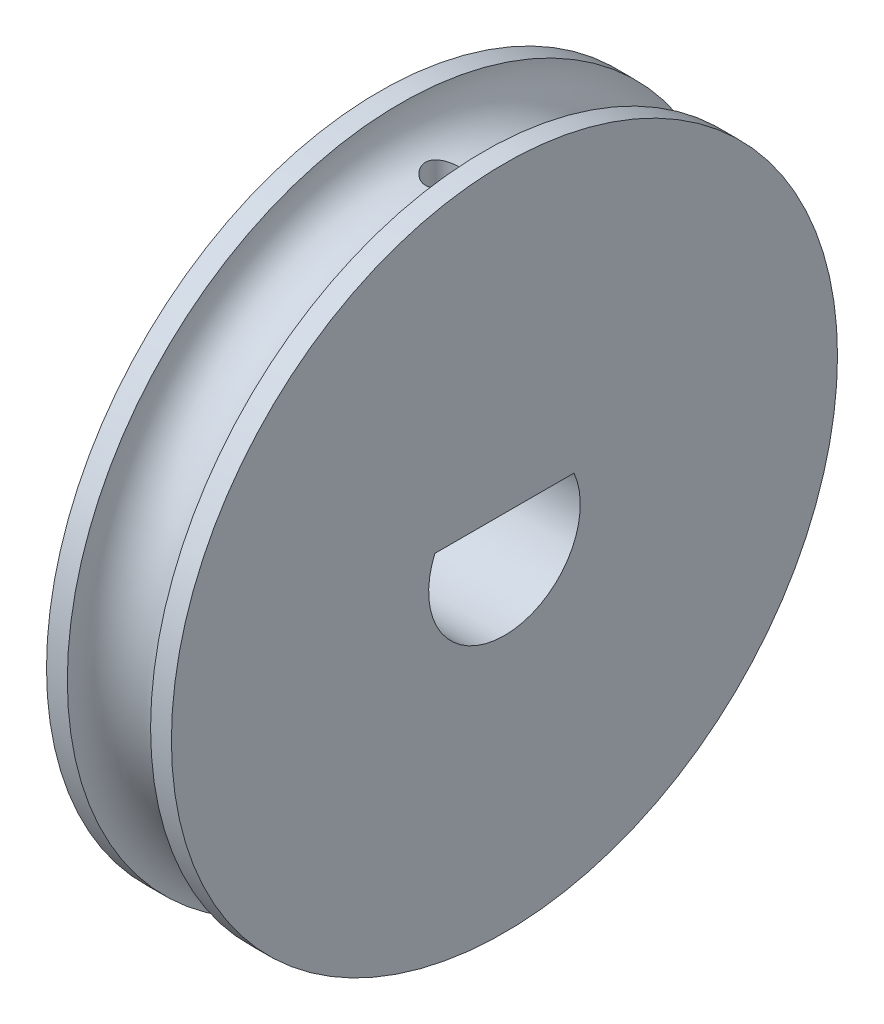
ISO-10303-21;
HEADER;
FILE_DESCRIPTION(('STEP AP214'),'2;1');
FILE_NAME('part.step','',(''),(''),'','','');
FILE_SCHEMA(('AUTOMOTIVE_DESIGN { 1 0 10303 214 1 1 1 1 }'));
ENDSEC;
DATA;
#1=APPLICATION_CONTEXT('core data for automotive mechanical design processes');
#2=APPLICATION_PROTOCOL_DEFINITION('international standard','automotive_design',2000,#1);
#3=PRODUCT_CONTEXT('',#1,'mechanical');
#4=PRODUCT('Part','Part','',(#3));
#5=PRODUCT_RELATED_PRODUCT_CATEGORY('part','',(#4));
#6=PRODUCT_DEFINITION_FORMATION('','',#4);
#7=PRODUCT_DEFINITION_CONTEXT('part definition',#1,'design');
#8=PRODUCT_DEFINITION('design','',#6,#7);
#9=PRODUCT_DEFINITION_SHAPE('','',#8);
#10=(LENGTH_UNIT() NAMED_UNIT(*) SI_UNIT(.MILLI.,.METRE.));
#11=(NAMED_UNIT(*) PLANE_ANGLE_UNIT() SI_UNIT($,.RADIAN.));
#12=(NAMED_UNIT(*) SI_UNIT($,.STERADIAN.) SOLID_ANGLE_UNIT());
#13=UNCERTAINTY_MEASURE_WITH_UNIT(LENGTH_MEASURE(1.E-05),#10,'distance_accuracy_value','');
#14=(GEOMETRIC_REPRESENTATION_CONTEXT(3) GLOBAL_UNCERTAINTY_ASSIGNED_CONTEXT((#13)) GLOBAL_UNIT_ASSIGNED_CONTEXT((#10,
#11,#12)) REPRESENTATION_CONTEXT('',''));
#15=CARTESIAN_POINT('',(0.,0.,0.));
#16=DIRECTION('',(0.,0.,1.));
#17=DIRECTION('',(1.,0.,0.));
#18=AXIS2_PLACEMENT_3D('',#15,#16,#17);
#19=CARTESIAN_POINT('',(-38.1,0.,0.));
#20=DIRECTION('',(1.,0.,0.));
#21=DIRECTION('',(0.,0.,-1.));
#22=AXIS2_PLACEMENT_3D('',#19,#20,#21);
#23=CYLINDRICAL_SURFACE('',#22,101.6);
#24=CARTESIAN_POINT('',(-31.75,0.,0.));
#25=DIRECTION('',(1.,0.,0.));
#26=DIRECTION('',(0.,0.,-1.));
#27=AXIS2_PLACEMENT_3D('',#24,#25,#26);
#28=CIRCLE('',#27,101.6);
#29=CARTESIAN_POINT('',(-31.75,0.,-101.6));
#30=VERTEX_POINT('',#29);
#31=EDGE_CURVE('E121',#30,#30,#28,.T.);
#32=CARTESIAN_POINT('',(-38.1,0.,0.));
#33=DIRECTION('',(1.,0.,0.));
#34=DIRECTION('',(0.,0.,-1.));
#35=AXIS2_PLACEMENT_3D('',#32,#33,#34);
#36=CIRCLE('',#35,101.6);
#37=CARTESIAN_POINT('',(-38.1,0.,-101.6));
#38=VERTEX_POINT('',#37);
#39=EDGE_CURVE('E100',#38,#38,#36,.T.);
#40=CARTESIAN_POINT('',(-31.75,0.,-101.6));
#41=CARTESIAN_POINT('',(-31.8161458333334,0.,-101.6));
#42=CARTESIAN_POINT('',(-31.8822916666667,0.,-101.6));
#43=CARTESIAN_POINT('',(-32.0145833333334,0.,-101.6));
#44=CARTESIAN_POINT('',(-32.0807291666667,0.,-101.6));
#45=CARTESIAN_POINT('',(-32.2130208333333,0.,-101.6));
#46=CARTESIAN_POINT('',(-32.2791666666667,0.,-101.6));
#47=CARTESIAN_POINT('',(-32.4114583333333,0.,-101.6));
#48=CARTESIAN_POINT('',(-32.4776041666667,0.,-101.6));
#49=CARTESIAN_POINT('',(-32.6098958333334,0.,-101.6));
#50=CARTESIAN_POINT('',(-32.6760416666667,0.,-101.6));
#51=CARTESIAN_POINT('',(-32.8083333333334,0.,-101.6));
#52=CARTESIAN_POINT('',(-32.8744791666667,0.,-101.6));
#53=CARTESIAN_POINT('',(-33.0067708333333,0.,-101.6));
#54=CARTESIAN_POINT('',(-33.0729166666667,0.,-101.6));
#55=CARTESIAN_POINT('',(-33.2052083333333,0.,-101.6));
#56=CARTESIAN_POINT('',(-33.2713541666667,0.,-101.6));
#57=CARTESIAN_POINT('',(-33.4036458333333,0.,-101.6));
#58=CARTESIAN_POINT('',(-33.4697916666667,0.,-101.6));
#59=CARTESIAN_POINT('',(-33.6020833333334,0.,-101.6));
#60=CARTESIAN_POINT('',(-33.6682291666667,0.,-101.6));
#61=CARTESIAN_POINT('',(-33.8005208333333,0.,-101.6));
#62=CARTESIAN_POINT('',(-33.8666666666667,0.,-101.6));
#63=CARTESIAN_POINT('',(-33.9989583333333,0.,-101.6));
#64=CARTESIAN_POINT('',(-34.0651041666667,0.,-101.6));
#65=CARTESIAN_POINT('',(-34.1973958333333,0.,-101.6));
#66=CARTESIAN_POINT('',(-34.2635416666667,0.,-101.6));
#67=CARTESIAN_POINT('',(-34.3958333333333,0.,-101.6));
#68=CARTESIAN_POINT('',(-34.4619791666667,0.,-101.6));
#69=CARTESIAN_POINT('',(-34.5942708333333,0.,-101.6));
#70=CARTESIAN_POINT('',(-34.6604166666667,0.,-101.6));
#71=CARTESIAN_POINT('',(-34.7927083333333,0.,-101.6));
#72=CARTESIAN_POINT('',(-34.8588541666667,0.,-101.6));
#73=CARTESIAN_POINT('',(-34.9911458333333,0.,-101.6));
#74=CARTESIAN_POINT('',(-35.0572916666667,0.,-101.6));
#75=CARTESIAN_POINT('',(-35.1895833333333,0.,-101.6));
#76=CARTESIAN_POINT('',(-35.2557291666667,0.,-101.6));
#77=CARTESIAN_POINT('',(-35.3880208333333,0.,-101.6));
#78=CARTESIAN_POINT('',(-35.4541666666667,0.,-101.6));
#79=CARTESIAN_POINT('',(-35.5864583333333,0.,-101.6));
#80=CARTESIAN_POINT('',(-35.6526041666667,0.,-101.6));
#81=CARTESIAN_POINT('',(-35.7848958333333,0.,-101.6));
#82=CARTESIAN_POINT('',(-35.8510416666667,0.,-101.6));
#83=CARTESIAN_POINT('',(-35.9833333333333,0.,-101.6));
#84=CARTESIAN_POINT('',(-36.0494791666667,0.,-101.6));
#85=CARTESIAN_POINT('',(-36.1817708333333,0.,-101.6));
#86=CARTESIAN_POINT('',(-36.2479166666667,0.,-101.6));
#87=CARTESIAN_POINT('',(-36.3802083333333,0.,-101.6));
#88=CARTESIAN_POINT('',(-36.4463541666667,0.,-101.6));
#89=CARTESIAN_POINT('',(-36.5786458333333,0.,-101.6));
#90=CARTESIAN_POINT('',(-36.6447916666667,0.,-101.6));
#91=CARTESIAN_POINT('',(-36.7770833333333,0.,-101.6));
#92=CARTESIAN_POINT('',(-36.8432291666667,0.,-101.6));
#93=CARTESIAN_POINT('',(-36.9755208333333,0.,-101.6));
#94=CARTESIAN_POINT('',(-37.0416666666667,0.,-101.6));
#95=CARTESIAN_POINT('',(-37.1739583333333,0.,-101.6));
#96=CARTESIAN_POINT('',(-37.2401041666667,0.,-101.6));
#97=CARTESIAN_POINT('',(-37.3723958333333,0.,-101.6));
#98=CARTESIAN_POINT('',(-37.4385416666667,0.,-101.6));
#99=CARTESIAN_POINT('',(-37.5708333333333,0.,-101.6));
#100=CARTESIAN_POINT('',(-37.6369791666667,0.,-101.6));
#101=CARTESIAN_POINT('',(-37.7692708333333,0.,-101.6));
#102=CARTESIAN_POINT('',(-37.8354166666667,0.,-101.6));
#103=CARTESIAN_POINT('',(-37.9677083333333,0.,-101.6));
#104=CARTESIAN_POINT('',(-38.0338541666667,0.,-101.6));
#105=CARTESIAN_POINT('',(-38.1,0.,-101.6));
#106=B_SPLINE_CURVE_WITH_KNOTS('',3,(#40,#41,#42,#43,#44,#45,#46,#47,#48,#49,#50,#51,#52,#53,
#54,#55,#56,#57,#58,#59,#60,#61,#62,#63,#64,#65,#66,#67,#68,#69,#70,#71,#72,#73,#74,#75,#76,#77,
#78,#79,#80,#81,#82,#83,#84,#85,#86,#87,#88,#89,#90,#91,#92,#93,#94,#95,#96,#97,#98,#99,#100,
#101,#102,#103,#104,#105),.UNSPECIFIED.,.F.,.F.,(4,2,2,2,2,2,2,2,2,2,2,2,2,2,2,2,2,2,2,2,2,2,2,
2,2,2,2,2,2,2,2,2,4),(0.,0.198437499999995,0.396874999999998,0.595312499999993,
0.793749999999996,0.992187499999998,1.19062499999999,1.3890625,1.58749999999999,
1.78593749999999,1.984375,2.18281249999999,2.38124999999999,2.57968749999999,2.77812499999999,
2.97656249999999,3.17499999999999,3.37343749999999,3.57187499999999,3.77031249999999,
3.96874999999999,4.16718749999999,4.36562499999999,4.56406249999999,4.76249999999999,
4.96093749999998,5.15937499999999,5.35781249999999,5.55624999999998,5.75468749999999,
5.95312499999998,6.15156249999998,6.34999999999998),.UNSPECIFIED.);
#107=EDGE_CURVE('BSEAM45',#30,#38,#106,.T.);
#108=ORIENTED_EDGE('',*,*,#31,.F.);
#109=ORIENTED_EDGE('',*,*,#39,.T.);
#110=ORIENTED_EDGE('',*,*,#107,.T.);
#111=ORIENTED_EDGE('',*,*,#107,.F.);
#112=EDGE_LOOP('',(#108,#110,#109,#111));
#113=FACE_BOUND('',#112,.T.);
#114=ADVANCED_FACE('F45',(#113),#23,.T.);
#115=CARTESIAN_POINT('',(-38.1,0.,0.));
#116=DIRECTION('',(1.,0.,0.));
#117=DIRECTION('',(0.,0.,-1.));
#118=AXIS2_PLACEMENT_3D('',#115,#116,#117);
#119=CYLINDRICAL_SURFACE('',#118,23.1243665486742);
#120=CARTESIAN_POINT('',(0.,0.,0.));
#121=DIRECTION('',(1.,0.,0.));
#122=DIRECTION('',(0.,0.,-1.));
#123=AXIS2_PLACEMENT_3D('',#120,#121,#122);
#124=CIRCLE('',#123,23.1243665486742);
#125=CARTESIAN_POINT('',(0.,9.19778406934596,21.2164345848007));
#126=VERTEX_POINT('',#125);
#127=CARTESIAN_POINT('',(0.,9.19778406934597,-21.2164345848007));
#128=VERTEX_POINT('',#127);
#129=EDGE_CURVE('E85',#126,#128,#124,.T.);
#130=ORIENTED_EDGE('',*,*,#129,.T.);
#131=DIRECTION('',(1.,0.,0.));
#132=VECTOR('',#131,1.);
#133=CARTESIAN_POINT('',(-38.1,9.19778406934597,-21.2164345848007));
#134=LINE('',#133,#132);
#135=CARTESIAN_POINT('',(-38.1,9.19778406934597,-21.2164345848007));
#136=VERTEX_POINT('',#135);
#137=EDGE_CURVE('E11',#136,#128,#134,.T.);
#138=ORIENTED_EDGE('',*,*,#137,.F.);
#139=CARTESIAN_POINT('',(-38.1,0.,0.));
#140=DIRECTION('',(1.,0.,0.));
#141=DIRECTION('',(0.,0.,-1.));
#142=AXIS2_PLACEMENT_3D('',#139,#140,#141);
#143=CIRCLE('',#142,23.1243665486742);
#144=CARTESIAN_POINT('',(-38.1,9.19778406934596,21.2164345848007));
#145=VERTEX_POINT('',#144);
#146=EDGE_CURVE('E69',#145,#136,#143,.T.);
#147=ORIENTED_EDGE('',*,*,#146,.F.);
#148=DIRECTION('',(1.,0.,0.));
#149=VECTOR('',#148,1.);
#150=CARTESIAN_POINT('',(-38.1,9.19778406934596,21.2164345848007));
#151=LINE('',#150,#149);
#152=EDGE_CURVE('E61',#145,#126,#151,.T.);
#153=ORIENTED_EDGE('',*,*,#152,.T.);
#154=EDGE_LOOP('',(#130,#138,#147,#153));
#155=FACE_BOUND('',#154,.T.);
#156=ADVANCED_FACE('F47',(#155),#119,.F.);
#157=CARTESIAN_POINT('',(-38.1,9.19778406934596,0.));
#158=DIRECTION('',(0.,-1.,0.));
#159=DIRECTION('',(0.,0.,-1.));
#160=AXIS2_PLACEMENT_3D('',#157,#158,#159);
#161=PLANE('',#160);
#162=CARTESIAN_POINT('',(-19.05,9.19778406934596,0.));
#163=DIRECTION('',(0.,-1.,0.));
#164=DIRECTION('',(0.,0.,-1.));
#165=AXIS2_PLACEMENT_3D('',#162,#163,#164);
#166=CIRCLE('',#165,1.5);
#167=CARTESIAN_POINT('',(-19.05,9.19778406934596,-1.5));
#168=VERTEX_POINT('',#167);
#169=EDGE_CURVE('E113',#168,#168,#166,.F.);
#170=ORIENTED_EDGE('',*,*,#169,.T.);
#171=EDGE_LOOP('',(#170));
#172=FACE_BOUND('',#171,.T.);
#173=DIRECTION('',(0.,0.,-1.));
#174=VECTOR('',#173,1.);
#175=CARTESIAN_POINT('',(0.,9.19778406934596,0.));
#176=LINE('',#175,#174);
#177=EDGE_CURVE('E83',#126,#128,#176,.T.);
#178=ORIENTED_EDGE('',*,*,#177,.F.);
#179=ORIENTED_EDGE('',*,*,#152,.F.);
#180=DIRECTION('',(0.,0.,-1.));
#181=VECTOR('',#180,1.);
#182=CARTESIAN_POINT('',(-38.1,9.19778406934596,0.));
#183=LINE('',#182,#181);
#184=EDGE_CURVE('E84',#145,#136,#183,.T.);
#185=ORIENTED_EDGE('',*,*,#184,.T.);
#186=ORIENTED_EDGE('',*,*,#137,.T.);
#187=EDGE_LOOP('',(#178,#179,#185,#186));
#188=FACE_BOUND('',#187,.T.);
#189=ADVANCED_FACE('F81',(#172,#188),#161,.T.);
#190=CARTESIAN_POINT('',(-6.35000000000002,0.,0.));
#191=DIRECTION('',(-1.,0.,0.));
#192=DIRECTION('',(0.,0.,1.));
#193=AXIS2_PLACEMENT_3D('',#190,#191,#192);
#194=CIRCLE('',#193,101.6);
#195=CARTESIAN_POINT('',(-6.35000000000001,0.,-101.6));
#196=VERTEX_POINT('',#195);
#197=EDGE_CURVE('E125',#196,#196,#194,.T.);
#198=CARTESIAN_POINT('',(0.,0.,0.));
#199=DIRECTION('',(1.,0.,0.));
#200=DIRECTION('',(0.,0.,-1.));
#201=AXIS2_PLACEMENT_3D('',#198,#199,#200);
#202=CIRCLE('',#201,101.6);
#203=CARTESIAN_POINT('',(0.,0.,-101.6));
#204=VERTEX_POINT('',#203);
#205=EDGE_CURVE('E93',#204,#204,#202,.T.);
#206=CARTESIAN_POINT('',(-6.35000000000001,0.,-101.6));
#207=CARTESIAN_POINT('',(-6.28385416666667,0.,-101.6));
#208=CARTESIAN_POINT('',(-6.21770833333334,0.,-101.6));
#209=CARTESIAN_POINT('',(-6.08541666666667,0.,-101.6));
#210=CARTESIAN_POINT('',(-6.01927083333334,0.,-101.6));
#211=CARTESIAN_POINT('',(-5.88697916666668,0.,-101.6));
#212=CARTESIAN_POINT('',(-5.82083333333334,0.,-101.6));
#213=CARTESIAN_POINT('',(-5.68854166666667,0.,-101.6));
#214=CARTESIAN_POINT('',(-5.62239583333334,0.,-101.6));
#215=CARTESIAN_POINT('',(-5.49010416666667,0.,-101.6));
#216=CARTESIAN_POINT('',(-5.42395833333334,0.,-101.6));
#217=CARTESIAN_POINT('',(-5.29166666666668,0.,-101.6));
#218=CARTESIAN_POINT('',(-5.22552083333334,0.,-101.6));
#219=CARTESIAN_POINT('',(-5.09322916666667,0.,-101.6));
#220=CARTESIAN_POINT('',(-5.02708333333334,0.,-101.6));
#221=CARTESIAN_POINT('',(-4.89479166666667,0.,-101.6));
#222=CARTESIAN_POINT('',(-4.82864583333334,0.,-101.6));
#223=CARTESIAN_POINT('',(-4.69635416666667,0.,-101.6));
#224=CARTESIAN_POINT('',(-4.63020833333334,0.,-101.6));
#225=CARTESIAN_POINT('',(-4.49791666666667,0.,-101.6));
#226=CARTESIAN_POINT('',(-4.43177083333334,0.,-101.6));
#227=CARTESIAN_POINT('',(-4.29947916666667,0.,-101.6));
#228=CARTESIAN_POINT('',(-4.23333333333334,0.,-101.6));
#229=CARTESIAN_POINT('',(-4.10104166666667,0.,-101.6));
#230=CARTESIAN_POINT('',(-4.03489583333334,0.,-101.6));
#231=CARTESIAN_POINT('',(-3.90260416666667,0.,-101.6));
#232=CARTESIAN_POINT('',(-3.83645833333334,0.,-101.6));
#233=CARTESIAN_POINT('',(-3.70416666666667,0.,-101.6));
#234=CARTESIAN_POINT('',(-3.63802083333334,0.,-101.6));
#235=CARTESIAN_POINT('',(-3.50572916666667,0.,-101.6));
#236=CARTESIAN_POINT('',(-3.43958333333334,0.,-101.6));
#237=CARTESIAN_POINT('',(-3.30729166666667,0.,-101.6));
#238=CARTESIAN_POINT('',(-3.24114583333334,0.,-101.6));
#239=CARTESIAN_POINT('',(-3.10885416666667,0.,-101.6));
#240=CARTESIAN_POINT('',(-3.04270833333334,0.,-101.6));
#241=CARTESIAN_POINT('',(-2.91041666666667,0.,-101.6));
#242=CARTESIAN_POINT('',(-2.84427083333334,0.,-101.6));
#243=CARTESIAN_POINT('',(-2.71197916666667,0.,-101.6));
#244=CARTESIAN_POINT('',(-2.64583333333334,0.,-101.6));
#245=CARTESIAN_POINT('',(-2.51354166666667,0.,-101.6));
#246=CARTESIAN_POINT('',(-2.44739583333334,0.,-101.6));
#247=CARTESIAN_POINT('',(-2.31510416666667,0.,-101.6));
#248=CARTESIAN_POINT('',(-2.24895833333334,0.,-101.6));
#249=CARTESIAN_POINT('',(-2.11666666666667,0.,-101.6));
#250=CARTESIAN_POINT('',(-2.05052083333334,0.,-101.6));
#251=CARTESIAN_POINT('',(-1.91822916666667,0.,-101.6));
#252=CARTESIAN_POINT('',(-1.85208333333334,0.,-101.6));
#253=CARTESIAN_POINT('',(-1.71979166666667,0.,-101.6));
#254=CARTESIAN_POINT('',(-1.65364583333334,0.,-101.6));
#255=CARTESIAN_POINT('',(-1.52135416666667,0.,-101.6));
#256=CARTESIAN_POINT('',(-1.45520833333334,0.,-101.6));
#257=CARTESIAN_POINT('',(-1.32291666666667,0.,-101.6));
#258=CARTESIAN_POINT('',(-1.25677083333333,0.,-101.6));
#259=CARTESIAN_POINT('',(-1.12447916666667,0.,-101.6));
#260=CARTESIAN_POINT('',(-1.05833333333334,0.,-101.6));
#261=CARTESIAN_POINT('',(-0.926041666666671,0.,-101.6));
#262=CARTESIAN_POINT('',(-0.859895833333337,0.,-101.6));
#263=CARTESIAN_POINT('',(-0.727604166666669,0.,-101.6));
#264=CARTESIAN_POINT('',(-0.661458333333334,0.,-101.6));
#265=CARTESIAN_POINT('',(-0.529166666666666,0.,-101.6));
#266=CARTESIAN_POINT('',(-0.463020833333332,0.,-101.6));
#267=CARTESIAN_POINT('',(-0.330729166666666,0.,-101.6));
#268=CARTESIAN_POINT('',(-0.264583333333334,0.,-101.6));
#269=CARTESIAN_POINT('',(-0.132291666666668,0.,-101.6));
#270=CARTESIAN_POINT('',(-0.0661458333333341,0.,-101.6));
#271=CARTESIAN_POINT('',(0.,0.,-101.6));
#272=B_SPLINE_CURVE_WITH_KNOTS('',3,(#206,#207,#208,#209,#210,#211,#212,#213,#214,#215,#216,
#217,#218,#219,#220,#221,#222,#223,#224,#225,#226,#227,#228,#229,#230,#231,#232,#233,#234,#235,
#236,#237,#238,#239,#240,#241,#242,#243,#244,#245,#246,#247,#248,#249,#250,#251,#252,#253,#254,
#255,#256,#257,#258,#259,#260,#261,#262,#263,#264,#265,#266,#267,#268,#269,#270,#271),
.UNSPECIFIED.,.F.,.F.,(4,2,2,2,2,2,2,2,2,2,2,2,2,2,2,2,2,2,2,2,2,2,2,2,2,2,2,2,2,2,2,2,4),(0.,
0.198437500000002,0.396874999999998,0.5953125,0.793750000000003,0.992187499999998,1.190625,
1.3890625,1.58750000000001,1.7859375,1.984375,2.18281250000001,2.38125,2.5796875,
2.77812500000001,2.9765625,3.175,3.37343750000001,3.571875,3.7703125,3.96875000000001,4.1671875,
4.365625,4.56406250000001,4.7625,4.96093750000001,5.15937500000001,5.3578125,5.55625000000001,
5.75468750000001,5.95312500000001,6.15156250000001,6.35000000000001),.UNSPECIFIED.);
#273=EDGE_CURVE('BSEAM152',#196,#204,#272,.T.);
#274=ORIENTED_EDGE('',*,*,#197,.F.);
#275=ORIENTED_EDGE('',*,*,#205,.F.);
#276=ORIENTED_EDGE('',*,*,#273,.T.);
#277=ORIENTED_EDGE('',*,*,#273,.F.);
#278=EDGE_LOOP('',(#274,#276,#275,#277));
#279=FACE_BOUND('',#278,.T.);
#280=ADVANCED_FACE('F152',(#279),#23,.T.);
#281=CARTESIAN_POINT('',(-38.1,0.,0.));
#282=DIRECTION('',(1.,0.,0.));
#283=DIRECTION('',(0.,0.,-1.));
#284=AXIS2_PLACEMENT_3D('',#281,#282,#283);
#285=PLANE('',#284);
#286=ORIENTED_EDGE('',*,*,#146,.T.);
#287=ORIENTED_EDGE('',*,*,#184,.F.);
#288=EDGE_LOOP('',(#286,#287));
#289=FACE_BOUND('',#288,.T.);
#290=ORIENTED_EDGE('',*,*,#39,.F.);
#291=EDGE_LOOP('',(#290));
#292=FACE_BOUND('',#291,.T.);
#293=ADVANCED_FACE('F159',(#289,#292),#285,.F.);
#294=CARTESIAN_POINT('',(0.,0.,0.));
#295=DIRECTION('',(1.,0.,0.));
#296=DIRECTION('',(0.,0.,-1.));
#297=AXIS2_PLACEMENT_3D('',#294,#295,#296);
#298=PLANE('',#297);
#299=ORIENTED_EDGE('',*,*,#129,.F.);
#300=ORIENTED_EDGE('',*,*,#177,.T.);
#301=EDGE_LOOP('',(#299,#300));
#302=FACE_BOUND('',#301,.T.);
#303=ORIENTED_EDGE('',*,*,#205,.T.);
#304=EDGE_LOOP('',(#303));
#305=FACE_BOUND('',#304,.T.);
#306=ADVANCED_FACE('F90',(#302,#305),#298,.T.);
#307=CARTESIAN_POINT('',(-19.05,38.1,0.));
#308=DIRECTION('',(0.,1.,0.));
#309=DIRECTION('',(0.,0.,1.));
#310=AXIS2_PLACEMENT_3D('',#307,#308,#309);
#311=CYLINDRICAL_SURFACE('',#310,5.);
#312=CARTESIAN_POINT('',(-23.0260412303138,89.4871059567853,-3.03168206361504));
#313=CARTESIAN_POINT('',(-23.1885767957271,89.5479378126555,-2.81851190274608));
#314=CARTESIAN_POINT('',(-23.3344321383054,89.6066032272783,-2.59164102712188));
#315=CARTESIAN_POINT('',(-23.5887372402165,89.7133359750617,-2.11491631426298));
#316=CARTESIAN_POINT('',(-23.6971277437711,89.7613864763635,-1.86502685330611));
#317=CARTESIAN_POINT('',(-23.8286924523627,89.821198950499,-1.47745666568283));
#318=CARTESIAN_POINT('',(-23.8674284399272,89.8391186134052,-1.34583743135836));
#319=CARTESIAN_POINT('',(-23.9340386403747,89.8702441792664,-1.07935050213369));
#320=CARTESIAN_POINT('',(-23.9619172378242,89.8834519848409,-0.94448414194022));
#321=CARTESIAN_POINT('',(-24.0064676573014,89.9046826406502,-0.672605701179929));
#322=CARTESIAN_POINT('',(-24.0231468989326,89.9127089235218,-0.535595102876358));
#323=CARTESIAN_POINT('',(-24.0451179411804,89.9233012353792,-0.260455195834658));
#324=CARTESIAN_POINT('',(-24.0504104857616,89.9258676210944,-0.122325960776069));
#325=CARTESIAN_POINT('',(-24.0495671637862,89.9254599197063,0.145178317465242));
#326=CARTESIAN_POINT('',(-24.0441301635738,89.9228246394678,0.274556734189543));
#327=CARTESIAN_POINT('',(-24.02326098745,89.9127643204536,0.532359398553656));
#328=CARTESIAN_POINT('',(-24.007825437712,89.9053376649198,0.660783309312431));
#329=CARTESIAN_POINT('',(-23.9671290868489,89.8859289119313,0.915691600344736));
#330=CARTESIAN_POINT('',(-23.9418702276424,89.8739477148507,1.04217635882555));
#331=CARTESIAN_POINT('',(-23.8817999269558,89.8458042392371,1.2923982800745));
#332=CARTESIAN_POINT('',(-23.8469847842908,89.8296403408672,1.41613435815622));
#333=CARTESIAN_POINT('',(-23.7291112840662,89.7757590443648,1.78066609285395));
#334=CARTESIAN_POINT('',(-23.6323655682018,89.7325212121756,2.01637986302405));
#335=CARTESIAN_POINT('',(-23.4054315077285,89.6358845314295,2.46868240289492));
#336=CARTESIAN_POINT('',(-23.2752317917279,89.5824822294578,2.68526463586602));
#337=CARTESIAN_POINT('',(-22.9717008352284,89.4656292574296,3.11369900511797));
#338=CARTESIAN_POINT('',(-22.7955768895291,89.4017077084995,3.32344620454608));
#339=CARTESIAN_POINT('',(-22.4112468064729,89.2743373523013,3.71168399395309));
#340=CARTESIAN_POINT('',(-22.2030260735608,89.2108887739398,3.89016028464577));
#341=CARTESIAN_POINT('',(-21.8640633590051,89.1192491867818,4.13545439300487));
#342=CARTESIAN_POINT('',(-21.7431561681551,89.0885553502804,4.21520546652954));
#343=CARTESIAN_POINT('',(-21.4943946153151,89.0299457471081,4.36416350606704));
#344=CARTESIAN_POINT('',(-21.3665431096132,89.0020288514237,4.43337476335153));
#345=CARTESIAN_POINT('',(-21.1046893191446,88.9497912656552,4.56064141733172));
#346=CARTESIAN_POINT('',(-20.9706866209023,88.925470817785,4.61869606272948));
#347=CARTESIAN_POINT('',(-20.6975424005015,88.881181562854,4.72302442458717));
#348=CARTESIAN_POINT('',(-20.5584035777002,88.8612105069474,4.76930423130037));
#349=CARTESIAN_POINT('',(-20.2835318979662,88.827172559022,4.84744421233493));
#350=CARTESIAN_POINT('',(-20.1480117054748,88.8128480666296,4.87994058275199));
#351=CARTESIAN_POINT('',(-19.8743730397498,88.7890859427199,4.933541821486));
#352=CARTESIAN_POINT('',(-19.7362557976895,88.779646053235,4.95465195342317));
#353=CARTESIAN_POINT('',(-19.458513680305,88.7659329365533,4.98524139564373));
#354=CARTESIAN_POINT('',(-19.3188891401274,88.7616585837404,4.99472323984049));
#355=CARTESIAN_POINT('',(-19.039278256254,88.7584056822692,5.00194368447515));
#356=CARTESIAN_POINT('',(-18.8992919317065,88.7594268588449,4.999682894196));
#357=CARTESIAN_POINT('',(-18.6304843190819,88.7664606137658,4.98405144964492));
#358=CARTESIAN_POINT('',(-18.5016036727078,88.7720980807554,4.97151565181356));
#359=CARTESIAN_POINT('',(-18.2454213256224,88.7877361536148,4.93653454222388));
#360=CARTESIAN_POINT('',(-18.1181201556463,88.797738187303,4.91408598759103));
#361=CARTESIAN_POINT('',(-17.8660466244764,88.821845041506,4.8595136457432));
#362=CARTESIAN_POINT('',(-17.7412734421362,88.835948506167,4.82739305579191));
#363=CARTESIAN_POINT('',(-17.4949954232269,88.8678991636025,4.75378870890039));
#364=CARTESIAN_POINT('',(-17.3734918551207,88.8857477863625,4.71230137506596));
#365=CARTESIAN_POINT('',(-17.0122005400849,88.9447441471115,4.57322243726125));
#366=CARTESIAN_POINT('',(-16.778468791313,88.9910575439746,4.46163260475386));
#367=CARTESIAN_POINT('',(-16.3325561414973,89.0929603002869,4.204977337202));
#368=CARTESIAN_POINT('',(-16.120383130313,89.1485530361698,4.05989970971174));
#369=CARTESIAN_POINT('',(-15.7053552037633,89.2687252810365,3.72688783316495));
#370=CARTESIAN_POINT('',(-15.5046122581873,89.3336679544468,3.53644964930239));
#371=CARTESIAN_POINT('',(-15.1368338653368,89.4620566473452,3.12462939400949));
#372=CARTESIAN_POINT('',(-14.9698145141275,89.5255019394444,2.90323263116277));
#373=CARTESIAN_POINT('',(-14.7446944111918,89.615642298624,2.54662836439783));
#374=CARTESIAN_POINT('',(-14.6726807990695,89.6454129297994,2.42078076236613));
#375=CARTESIAN_POINT('',(-14.5396151279935,89.7017265716021,2.16274586388674));
#376=CARTESIAN_POINT('',(-14.4785586001021,89.7282708966731,2.0305611800722));
#377=CARTESIAN_POINT('',(-14.3680159349261,89.7772219564873,1.7607601150387));
#378=CARTESIAN_POINT('',(-14.3185254296965,89.7996302525408,1.62314580735798));
#379=CARTESIAN_POINT('',(-14.2316420030681,89.8395062408757,1.34345122281826));
#380=CARTESIAN_POINT('',(-14.1942479039518,89.8569744141114,1.20137138220648));
#381=CARTESIAN_POINT('',(-14.1341146513571,89.8853150514375,0.923528116602495));
#382=CARTESIAN_POINT('',(-14.1105630085506,89.8965503383895,0.787977274752166));
#383=CARTESIAN_POINT('',(-14.0746968927033,89.9137346118698,0.515068685669953));
#384=CARTESIAN_POINT('',(-14.0623815089031,89.9196840268455,0.37771108580124));
#385=CARTESIAN_POINT('',(-14.0491490723517,89.9260785100453,0.102370858663041));
#386=CARTESIAN_POINT('',(-14.0482277653858,89.9265256326639,-0.0356115160828786));
#387=CARTESIAN_POINT('',(-14.0577838730637,89.9219047654479,-0.311082338986315));
#388=CARTESIAN_POINT('',(-14.0682608082054,89.9168370076137,-0.448570807677395));
#389=CARTESIAN_POINT('',(-14.0992501339123,89.9019607317449,-0.711503067502591));
#390=CARTESIAN_POINT('',(-14.1189376298072,89.8925425815946,-0.837066834836254));
#391=CARTESIAN_POINT('',(-14.1677076947982,89.8694515754833,-1.08596983401638));
#392=CARTESIAN_POINT('',(-14.1967932555258,89.8557773647661,-1.20930834429206));
#393=CARTESIAN_POINT('',(-14.2977438485688,89.8089429374396,-1.57473685695461));
#394=CARTESIAN_POINT('',(-14.383327283663,89.7699584115945,-1.81244370392702));
#395=CARTESIAN_POINT('',(-14.5919314049951,89.6789962428716,-2.2789121386477));
#396=CARTESIAN_POINT('',(-14.7162269393598,89.626589004237,-2.50701148625874));
#397=CARTESIAN_POINT('',(-14.9976150596284,89.514950246529,-2.94022212207918));
#398=CARTESIAN_POINT('',(-15.154722622611,89.4557156166392,-3.14532284661352));
#399=CARTESIAN_POINT('',(-15.5142449283364,89.3304136650963,-3.54648782039434));
#400=CARTESIAN_POINT('',(-15.7195045986786,89.2642207061919,-3.73996631334148));
#401=CARTESIAN_POINT('',(-16.160871617883,89.1372737373533,-4.09050493282995));
#402=CARTESIAN_POINT('',(-16.396985285232,89.0765208457786,-4.24755758151437));
#403=CARTESIAN_POINT('',(-16.7718548051587,88.994013183864,-4.45318761379463));
#404=CARTESIAN_POINT('',(-16.901408744045,88.9677693213872,-4.51713599538772));
#405=CARTESIAN_POINT('',(-17.1661605805804,88.9191445454623,-4.63379307633693));
#406=CARTESIAN_POINT('',(-17.3013560317731,88.8967619787348,-4.68650658838055));
#407=CARTESIAN_POINT('',(-17.5763791974146,88.856552588104,-4.78011951342237));
#408=CARTESIAN_POINT('',(-17.7162052949014,88.8387241925011,-4.82102300283862));
#409=CARTESIAN_POINT('',(-17.9994236785429,88.8081796453697,-4.89055641604357));
#410=CARTESIAN_POINT('',(-18.1428156373101,88.7954630263471,-4.91918746221581));
#411=CARTESIAN_POINT('',(-18.4208111560374,88.7763248849084,-4.96209196183897));
#412=CARTESIAN_POINT('',(-18.5552431018982,88.7694946415858,-4.97729980929895));
#413=CARTESIAN_POINT('',(-18.8250539878047,88.7607411220374,-4.99676795271561));
#414=CARTESIAN_POINT('',(-18.9604328738801,88.7588175684062,-5.00102886757009));
#415=CARTESIAN_POINT('',(-19.231026482156,88.7599333248915,-4.99855288306764));
#416=CARTESIAN_POINT('',(-19.3662412421986,88.7629710991057,-4.9918193873038));
#417=CARTESIAN_POINT('',(-19.6354799361108,88.7739176296313,-4.96744257915381));
#418=CARTESIAN_POINT('',(-19.7695038908831,88.78182630027,-4.94979945865382));
#419=CARTESIAN_POINT('',(-20.0286878741177,88.8017774520965,-4.90495526930458));
#420=CARTESIAN_POINT('',(-20.1539559194202,88.8135933414108,-4.87827650379498));
#421=CARTESIAN_POINT('',(-20.4016919708903,88.8411136296006,-4.81552530226236));
#422=CARTESIAN_POINT('',(-20.5241590403418,88.8568193091338,-4.77944977228626));
#423=CARTESIAN_POINT('',(-20.8862577042792,88.9092319297744,-4.65756396421632));
#424=CARTESIAN_POINT('',(-21.1206807610402,88.9512421090631,-4.55807798305337));
#425=CARTESIAN_POINT('',(-21.5803157165548,89.0476478008976,-4.3206032312847));
#426=CARTESIAN_POINT('',(-21.8046103823217,89.1025234470434,-4.18105624944299));
#427=CARTESIAN_POINT('',(-22.2273028618049,89.2182197766859,-3.86955898568567));
#428=CARTESIAN_POINT('',(-22.425738968502,89.2790314306937,-3.69765756071988));
#429=CARTESIAN_POINT('',(-22.6837759246566,89.3647026828084,-3.43612095797758));
#430=CARTESIAN_POINT('',(-22.7557685674124,89.3894384415447,-3.35834930919973));
#431=CARTESIAN_POINT('',(-22.8947264211617,89.4385980021236,-3.19832861693346));
#432=CARTESIAN_POINT('',(-22.9616911207989,89.4630217720268,-3.11607911949837));
#433=CARTESIAN_POINT('',(-23.0260412303138,89.4871059567853,-3.03168206361504));
#434=B_SPLINE_CURVE_WITH_KNOTS('',3,(#312,#313,#314,#315,#316,#317,#318,#319,#320,#321,#322,
#323,#324,#325,#326,#327,#328,#329,#330,#331,#332,#333,#334,#335,#336,#337,#338,#339,#340,#341,
#342,#343,#344,#345,#346,#347,#348,#349,#350,#351,#352,#353,#354,#355,#356,#357,#358,#359,#360,
#361,#362,#363,#364,#365,#366,#367,#368,#369,#370,#371,#372,#373,#374,#375,#376,#377,#378,#379,
#380,#381,#382,#383,#384,#385,#386,#387,#388,#389,#390,#391,#392,#393,#394,#395,#396,#397,#398,
#399,#400,#401,#402,#403,#404,#405,#406,#407,#408,#409,#410,#411,#412,#413,#414,#415,#416,#417,
#418,#419,#420,#421,#422,#423,#424,#425,#426,#427,#428,#429,#430,#431,#432,#433),.UNSPECIFIED.,
.T.,.F.,(4,2,2,2,2,2,2,2,2,2,2,2,2,2,2,2,2,2,2,2,2,2,2,2,2,2,2,2,2,2,2,2,2,2,2,2,2,2,2,2,2,2,2,
2,2,2,2,2,2,2,2,2,2,2,2,2,2,2,2,2,4),(0.,0.824290672625141,1.64987917142148,2.0645188383147,
2.47899088618528,2.89318807354933,3.30735819797589,3.69544012465814,4.08365307070873,
4.47178931195107,4.8600760924652,5.63184549953584,6.40387758757273,7.24405498275061,
8.08461556984134,8.52831502342519,8.97183333959855,9.4153815123026,9.85869980181038,
10.2784310085247,10.6979680156077,11.1174135853742,11.5368373918403,11.9252111409757,
12.3137120375334,12.7020846489188,13.0906058204079,13.8762968533632,14.6622743980912,
15.5112864935627,16.3607028643651,16.8042827677094,17.2476813400817,17.6909121899995,
18.134099873542,18.547664245141,18.9611950921371,19.3745715341606,19.7879305869078,
20.1698144498462,20.551819995617,21.3152213830141,22.1070364423279,22.8992137193218,
23.7645828641185,24.6301295035029,25.0701651107042,25.5100118390447,25.9497065652637,
26.3893610703582,26.7952234572487,27.201062897724,27.6067767243321,28.012483415163,
28.3978940894253,28.7834318237199,29.5542234319955,30.3604083184549,31.1653854499978,
31.4917005436099,31.8180487795828),.UNSPECIFIED.);
#435=CARTESIAN_POINT('',(-23.0260412303138,89.4871059567853,-3.03168206361504));
#436=VERTEX_POINT('',#435);
#437=EDGE_CURVE('E49',#436,#436,#434,.T.);
#438=ORIENTED_EDGE('',*,*,#437,.T.);
#439=EDGE_LOOP('',(#438));
#440=FACE_BOUND('',#439,.T.);
#441=CARTESIAN_POINT('',(-19.05,38.1,0.));
#442=DIRECTION('',(0.,1.,0.));
#443=DIRECTION('',(0.,0.,1.));
#444=AXIS2_PLACEMENT_3D('',#441,#442,#443);
#445=CIRCLE('',#444,5.);
#446=CARTESIAN_POINT('',(-19.05,38.1,5.));
#447=VERTEX_POINT('',#446);
#448=EDGE_CURVE('E88',#447,#447,#445,.T.);
#449=ORIENTED_EDGE('',*,*,#448,.F.);
#450=EDGE_LOOP('',(#449));
#451=FACE_BOUND('',#450,.T.);
#452=ADVANCED_FACE('F134',(#440,#451),#311,.F.);
#453=CARTESIAN_POINT('',(0.,38.1,0.));
#454=DIRECTION('',(0.,1.,0.));
#455=DIRECTION('',(0.,0.,1.));
#456=AXIS2_PLACEMENT_3D('',#453,#454,#455);
#457=PLANE('',#456);
#458=CARTESIAN_POINT('',(-19.05,38.1,0.));
#459=DIRECTION('',(0.,1.,0.));
#460=DIRECTION('',(0.,0.,1.));
#461=AXIS2_PLACEMENT_3D('',#458,#459,#460);
#462=CIRCLE('',#461,1.5);
#463=CARTESIAN_POINT('',(-19.05,38.1,1.5));
#464=VERTEX_POINT('',#463);
#465=EDGE_CURVE('E117',#464,#464,#462,.T.);
#466=ORIENTED_EDGE('',*,*,#465,.F.);
#467=EDGE_LOOP('',(#466));
#468=FACE_BOUND('',#467,.T.);
#469=ORIENTED_EDGE('',*,*,#448,.T.);
#470=EDGE_LOOP('',(#469));
#471=FACE_BOUND('',#470,.T.);
#472=ADVANCED_FACE('F145',(#468,#471),#457,.T.);
#473=CARTESIAN_POINT('',(-19.05,4.95514338222668,0.));
#474=DIRECTION('',(0.,1.,0.));
#475=DIRECTION('',(0.,0.,1.));
#476=AXIS2_PLACEMENT_3D('',#473,#474,#475);
#477=CYLINDRICAL_SURFACE('',#476,1.5);
#478=ORIENTED_EDGE('',*,*,#465,.T.);
#479=EDGE_LOOP('',(#478));
#480=FACE_BOUND('',#479,.T.);
#481=ORIENTED_EDGE('',*,*,#169,.F.);
#482=EDGE_LOOP('',(#481));
#483=FACE_BOUND('',#482,.T.);
#484=ADVANCED_FACE('F139',(#480,#483),#477,.F.);
#485=CARTESIAN_POINT('',(-19.05,0.,0.));
#486=DIRECTION('',(-1.,0.,0.));
#487=DIRECTION('',(0.,0.,1.));
#488=AXIS2_PLACEMENT_3D('',#485,#486,#487);
#489=TOROIDAL_SURFACE('',#488,101.6,12.7);
#490=ORIENTED_EDGE('',*,*,#31,.T.);
#491=EDGE_LOOP('',(#490));
#492=FACE_BOUND('',#491,.T.);
#493=ORIENTED_EDGE('',*,*,#197,.T.);
#494=EDGE_LOOP('',(#493));
#495=FACE_BOUND('',#494,.T.);
#496=ORIENTED_EDGE('',*,*,#437,.F.);
#497=EDGE_LOOP('',(#496));
#498=FACE_BOUND('',#497,.T.);
#499=ADVANCED_FACE('F137',(#492,#495,#498),#489,.F.);
#500=CLOSED_SHELL('',(#114,#156,#189,#280,#293,#306,#452,#472,#484,#499));
#501=MANIFOLD_SOLID_BREP('B2',#500);
#502=ADVANCED_BREP_SHAPE_REPRESENTATION('',(#18,#501),#14);
#503=SHAPE_DEFINITION_REPRESENTATION(#9,#502);
ENDSEC;
END-ISO-10303-21;
